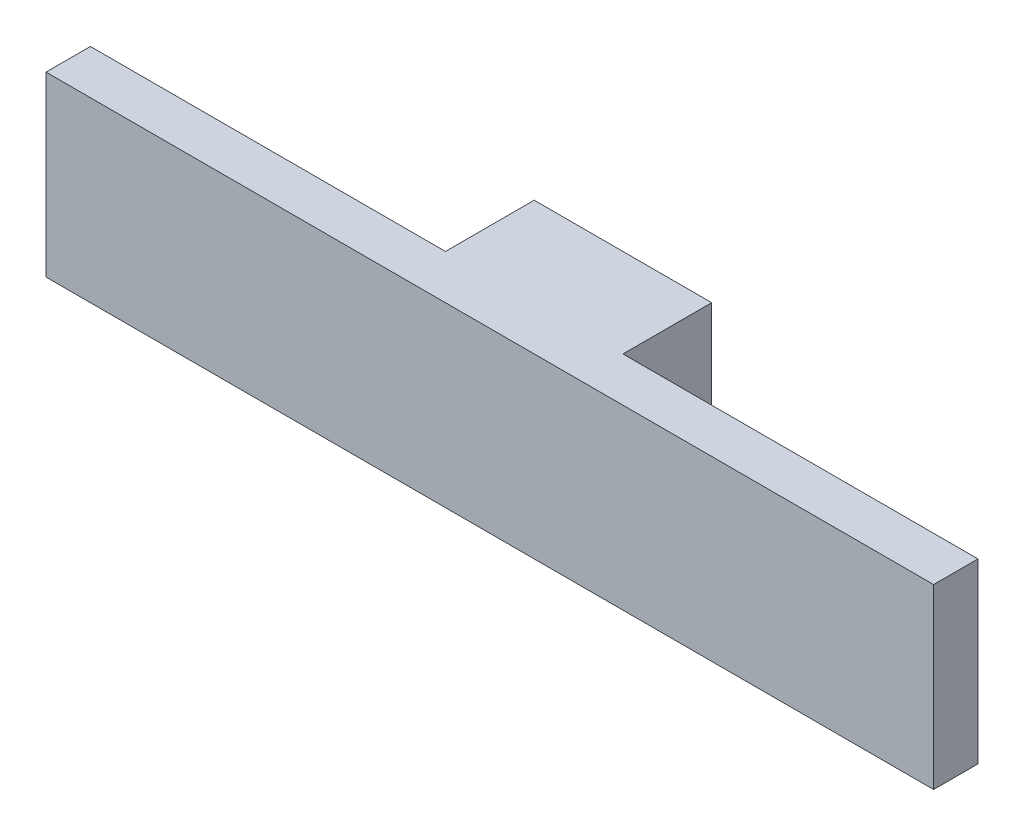
ISO-10303-21;
HEADER;
FILE_DESCRIPTION(('STEP AP214'),'2;1');
FILE_NAME('part.step','',(''),(''),'','','');
FILE_SCHEMA(('AUTOMOTIVE_DESIGN { 1 0 10303 214 1 1 1 1 }'));
ENDSEC;
DATA;
#1=APPLICATION_CONTEXT('core data for automotive mechanical design processes');
#2=APPLICATION_PROTOCOL_DEFINITION('international standard','automotive_design',2000,#1);
#3=PRODUCT_CONTEXT('',#1,'mechanical');
#4=PRODUCT('Part','Part','',(#3));
#5=PRODUCT_RELATED_PRODUCT_CATEGORY('part','',(#4));
#6=PRODUCT_DEFINITION_FORMATION('','',#4);
#7=PRODUCT_DEFINITION_CONTEXT('part definition',#1,'design');
#8=PRODUCT_DEFINITION('design','',#6,#7);
#9=PRODUCT_DEFINITION_SHAPE('','',#8);
#10=(LENGTH_UNIT() NAMED_UNIT(*) SI_UNIT(.MILLI.,.METRE.));
#11=(NAMED_UNIT(*) PLANE_ANGLE_UNIT() SI_UNIT($,.RADIAN.));
#12=(NAMED_UNIT(*) SI_UNIT($,.STERADIAN.) SOLID_ANGLE_UNIT());
#13=UNCERTAINTY_MEASURE_WITH_UNIT(LENGTH_MEASURE(1.E-05),#10,'distance_accuracy_value','');
#14=(GEOMETRIC_REPRESENTATION_CONTEXT(3) GLOBAL_UNCERTAINTY_ASSIGNED_CONTEXT((#13)) GLOBAL_UNIT_ASSIGNED_CONTEXT((#10,
#11,#12)) REPRESENTATION_CONTEXT('',''));
#15=CARTESIAN_POINT('',(0.,0.,0.));
#16=DIRECTION('',(0.,0.,1.));
#17=DIRECTION('',(1.,0.,0.));
#18=AXIS2_PLACEMENT_3D('',#15,#16,#17);
#19=CARTESIAN_POINT('',(50.,20.,15.));
#20=DIRECTION('',(-1.,0.,0.));
#21=DIRECTION('',(0.,0.,1.));
#22=AXIS2_PLACEMENT_3D('',#19,#20,#21);
#23=PLANE('',#22);
#24=DIRECTION('',(0.,0.,-1.));
#25=VECTOR('',#24,1.);
#26=CARTESIAN_POINT('',(50.,0.,15.));
#27=LINE('',#26,#25);
#28=CARTESIAN_POINT('',(50.,0.,15.));
#29=VERTEX_POINT('',#28);
#30=CARTESIAN_POINT('',(50.,0.,10.));
#31=VERTEX_POINT('',#30);
#32=EDGE_CURVE('E140',#29,#31,#27,.T.);
#33=ORIENTED_EDGE('',*,*,#32,.T.);
#34=DIRECTION('',(0.,-1.,0.));
#35=VECTOR('',#34,1.);
#36=CARTESIAN_POINT('',(50.,20.,10.));
#37=LINE('',#36,#35);
#38=CARTESIAN_POINT('',(50.,20.,10.));
#39=VERTEX_POINT('',#38);
#40=EDGE_CURVE('E11',#39,#31,#37,.T.);
#41=ORIENTED_EDGE('',*,*,#40,.F.);
#42=DIRECTION('',(0.,0.,-1.));
#43=VECTOR('',#42,1.);
#44=CARTESIAN_POINT('',(50.,20.,15.));
#45=LINE('',#44,#43);
#46=CARTESIAN_POINT('',(50.,20.,15.));
#47=VERTEX_POINT('',#46);
#48=EDGE_CURVE('E162',#47,#39,#45,.T.);
#49=ORIENTED_EDGE('',*,*,#48,.F.);
#50=DIRECTION('',(0.,-1.,0.));
#51=VECTOR('',#50,1.);
#52=CARTESIAN_POINT('',(50.,20.,15.));
#53=LINE('',#52,#51);
#54=EDGE_CURVE('E136',#47,#29,#53,.T.);
#55=ORIENTED_EDGE('',*,*,#54,.T.);
#56=EDGE_LOOP('',(#33,#41,#49,#55));
#57=FACE_BOUND('',#56,.T.);
#58=ADVANCED_FACE('F39',(#57),#23,.F.);
#59=CARTESIAN_POINT('',(50.,20.,10.));
#60=DIRECTION('',(0.,0.,1.));
#61=DIRECTION('',(1.,0.,0.));
#62=AXIS2_PLACEMENT_3D('',#59,#60,#61);
#63=PLANE('',#62);
#64=DIRECTION('',(-1.,0.,0.));
#65=VECTOR('',#64,1.);
#66=CARTESIAN_POINT('',(50.,0.,10.));
#67=LINE('',#66,#65);
#68=CARTESIAN_POINT('',(10.,0.,10.));
#69=VERTEX_POINT('',#68);
#70=EDGE_CURVE('E144',#31,#69,#67,.T.);
#71=ORIENTED_EDGE('',*,*,#70,.T.);
#72=DIRECTION('',(0.,-1.,0.));
#73=VECTOR('',#72,1.);
#74=CARTESIAN_POINT('',(10.,20.,10.));
#75=LINE('',#74,#73);
#76=CARTESIAN_POINT('',(10.,20.,10.));
#77=VERTEX_POINT('',#76);
#78=EDGE_CURVE('E48',#77,#69,#75,.T.);
#79=ORIENTED_EDGE('',*,*,#78,.F.);
#80=DIRECTION('',(-1.,0.,0.));
#81=VECTOR('',#80,1.);
#82=CARTESIAN_POINT('',(50.,20.,10.));
#83=LINE('',#82,#81);
#84=EDGE_CURVE('E99',#39,#77,#83,.T.);
#85=ORIENTED_EDGE('',*,*,#84,.F.);
#86=ORIENTED_EDGE('',*,*,#40,.T.);
#87=EDGE_LOOP('',(#71,#79,#85,#86));
#88=FACE_BOUND('',#87,.T.);
#89=ADVANCED_FACE('F208',(#88),#63,.F.);
#90=CARTESIAN_POINT('',(10.,20.,10.));
#91=DIRECTION('',(-1.,0.,0.));
#92=DIRECTION('',(0.,0.,1.));
#93=AXIS2_PLACEMENT_3D('',#90,#91,#92);
#94=PLANE('',#93);
#95=DIRECTION('',(0.,0.,-1.));
#96=VECTOR('',#95,1.);
#97=CARTESIAN_POINT('',(10.,0.,10.));
#98=LINE('',#97,#96);
#99=CARTESIAN_POINT('',(10.,0.,0.));
#100=VERTEX_POINT('',#99);
#101=EDGE_CURVE('E147',#69,#100,#98,.T.);
#102=ORIENTED_EDGE('',*,*,#101,.T.);
#103=DIRECTION('',(0.,-1.,0.));
#104=VECTOR('',#103,1.);
#105=CARTESIAN_POINT('',(10.,20.,0.));
#106=LINE('',#105,#104);
#107=CARTESIAN_POINT('',(10.,20.,0.));
#108=VERTEX_POINT('',#107);
#109=EDGE_CURVE('E173',#108,#100,#106,.T.);
#110=ORIENTED_EDGE('',*,*,#109,.F.);
#111=DIRECTION('',(0.,0.,-1.));
#112=VECTOR('',#111,1.);
#113=CARTESIAN_POINT('',(10.,20.,10.));
#114=LINE('',#113,#112);
#115=EDGE_CURVE('E183',#77,#108,#114,.T.);
#116=ORIENTED_EDGE('',*,*,#115,.F.);
#117=ORIENTED_EDGE('',*,*,#78,.T.);
#118=EDGE_LOOP('',(#102,#110,#116,#117));
#119=FACE_BOUND('',#118,.T.);
#120=ADVANCED_FACE('F181',(#119),#94,.F.);
#121=CARTESIAN_POINT('',(-10.,20.,0.));
#122=DIRECTION('',(0.,0.,1.));
#123=DIRECTION('',(1.,0.,0.));
#124=AXIS2_PLACEMENT_3D('',#121,#122,#123);
#125=PLANE('',#124);
#126=DIRECTION('',(-1.,0.,0.));
#127=VECTOR('',#126,1.);
#128=CARTESIAN_POINT('',(-10.,0.,0.));
#129=LINE('',#128,#127);
#130=CARTESIAN_POINT('',(-10.,0.,0.));
#131=VERTEX_POINT('',#130);
#132=EDGE_CURVE('E150',#100,#131,#129,.T.);
#133=ORIENTED_EDGE('',*,*,#132,.T.);
#134=DIRECTION('',(0.,-1.,0.));
#135=VECTOR('',#134,1.);
#136=CARTESIAN_POINT('',(-10.,20.,0.));
#137=LINE('',#136,#135);
#138=CARTESIAN_POINT('',(-10.,20.,0.));
#139=VERTEX_POINT('',#138);
#140=EDGE_CURVE('E169',#139,#131,#137,.T.);
#141=ORIENTED_EDGE('',*,*,#140,.F.);
#142=DIRECTION('',(-1.,0.,0.));
#143=VECTOR('',#142,1.);
#144=CARTESIAN_POINT('',(-10.,20.,0.));
#145=LINE('',#144,#143);
#146=EDGE_CURVE('E196',#108,#139,#145,.T.);
#147=ORIENTED_EDGE('',*,*,#146,.F.);
#148=ORIENTED_EDGE('',*,*,#109,.T.);
#149=EDGE_LOOP('',(#133,#141,#147,#148));
#150=FACE_BOUND('',#149,.T.);
#151=ADVANCED_FACE('F191',(#150),#125,.F.);
#152=CARTESIAN_POINT('',(-10.,20.,10.));
#153=DIRECTION('',(1.,0.,0.));
#154=DIRECTION('',(0.,0.,-1.));
#155=AXIS2_PLACEMENT_3D('',#152,#153,#154);
#156=PLANE('',#155);
#157=DIRECTION('',(0.,0.,1.));
#158=VECTOR('',#157,1.);
#159=CARTESIAN_POINT('',(-10.,0.,10.));
#160=LINE('',#159,#158);
#161=CARTESIAN_POINT('',(-10.,0.,10.));
#162=VERTEX_POINT('',#161);
#163=EDGE_CURVE('E153',#131,#162,#160,.T.);
#164=ORIENTED_EDGE('',*,*,#163,.T.);
#165=DIRECTION('',(0.,-1.,0.));
#166=VECTOR('',#165,1.);
#167=CARTESIAN_POINT('',(-10.,20.,10.));
#168=LINE('',#167,#166);
#169=CARTESIAN_POINT('',(-10.,20.,10.));
#170=VERTEX_POINT('',#169);
#171=EDGE_CURVE('E129',#170,#162,#168,.T.);
#172=ORIENTED_EDGE('',*,*,#171,.F.);
#173=DIRECTION('',(0.,0.,1.));
#174=VECTOR('',#173,1.);
#175=CARTESIAN_POINT('',(-10.,20.,10.));
#176=LINE('',#175,#174);
#177=EDGE_CURVE('E118',#139,#170,#176,.T.);
#178=ORIENTED_EDGE('',*,*,#177,.F.);
#179=ORIENTED_EDGE('',*,*,#140,.T.);
#180=EDGE_LOOP('',(#164,#172,#178,#179));
#181=FACE_BOUND('',#180,.T.);
#182=ADVANCED_FACE('F194',(#181),#156,.F.);
#183=CARTESIAN_POINT('',(-50.,20.,10.));
#184=DIRECTION('',(0.,0.,1.));
#185=DIRECTION('',(1.,0.,0.));
#186=AXIS2_PLACEMENT_3D('',#183,#184,#185);
#187=PLANE('',#186);
#188=DIRECTION('',(-1.,0.,0.));
#189=VECTOR('',#188,1.);
#190=CARTESIAN_POINT('',(-50.,0.,10.));
#191=LINE('',#190,#189);
#192=CARTESIAN_POINT('',(-50.,0.,10.));
#193=VERTEX_POINT('',#192);
#194=EDGE_CURVE('E127',#162,#193,#191,.T.);
#195=ORIENTED_EDGE('',*,*,#194,.T.);
#196=DIRECTION('',(0.,-1.,0.));
#197=VECTOR('',#196,1.);
#198=CARTESIAN_POINT('',(-50.,20.,10.));
#199=LINE('',#198,#197);
#200=CARTESIAN_POINT('',(-50.,20.,10.));
#201=VERTEX_POINT('',#200);
#202=EDGE_CURVE('E124',#201,#193,#199,.T.);
#203=ORIENTED_EDGE('',*,*,#202,.F.);
#204=DIRECTION('',(-1.,0.,0.));
#205=VECTOR('',#204,1.);
#206=CARTESIAN_POINT('',(-50.,20.,10.));
#207=LINE('',#206,#205);
#208=EDGE_CURVE('E112',#170,#201,#207,.T.);
#209=ORIENTED_EDGE('',*,*,#208,.F.);
#210=ORIENTED_EDGE('',*,*,#171,.T.);
#211=EDGE_LOOP('',(#195,#203,#209,#210));
#212=FACE_BOUND('',#211,.T.);
#213=ADVANCED_FACE('F125',(#212),#187,.F.);
#214=CARTESIAN_POINT('',(-50.,20.,15.));
#215=DIRECTION('',(1.,0.,0.));
#216=DIRECTION('',(0.,0.,-1.));
#217=AXIS2_PLACEMENT_3D('',#214,#215,#216);
#218=PLANE('',#217);
#219=DIRECTION('',(0.,0.,1.));
#220=VECTOR('',#219,1.);
#221=CARTESIAN_POINT('',(-50.,0.,15.));
#222=LINE('',#221,#220);
#223=CARTESIAN_POINT('',(-50.,0.,15.));
#224=VERTEX_POINT('',#223);
#225=EDGE_CURVE('E85',#193,#224,#222,.T.);
#226=ORIENTED_EDGE('',*,*,#225,.T.);
#227=DIRECTION('',(0.,-1.,0.));
#228=VECTOR('',#227,1.);
#229=CARTESIAN_POINT('',(-50.,20.,15.));
#230=LINE('',#229,#228);
#231=CARTESIAN_POINT('',(-50.,20.,15.));
#232=VERTEX_POINT('',#231);
#233=EDGE_CURVE('E130',#232,#224,#230,.T.);
#234=ORIENTED_EDGE('',*,*,#233,.F.);
#235=DIRECTION('',(0.,0.,1.));
#236=VECTOR('',#235,1.);
#237=CARTESIAN_POINT('',(-50.,20.,15.));
#238=LINE('',#237,#236);
#239=EDGE_CURVE('E116',#201,#232,#238,.T.);
#240=ORIENTED_EDGE('',*,*,#239,.F.);
#241=ORIENTED_EDGE('',*,*,#202,.T.);
#242=EDGE_LOOP('',(#226,#234,#240,#241));
#243=FACE_BOUND('',#242,.T.);
#244=ADVANCED_FACE('F132',(#243),#218,.F.);
#245=CARTESIAN_POINT('',(50.,20.,15.));
#246=DIRECTION('',(0.,0.,-1.));
#247=DIRECTION('',(-1.,0.,0.));
#248=AXIS2_PLACEMENT_3D('',#245,#246,#247);
#249=PLANE('',#248);
#250=DIRECTION('',(1.,0.,0.));
#251=VECTOR('',#250,1.);
#252=CARTESIAN_POINT('',(50.,0.,15.));
#253=LINE('',#252,#251);
#254=EDGE_CURVE('E91',#224,#29,#253,.T.);
#255=ORIENTED_EDGE('',*,*,#254,.T.);
#256=ORIENTED_EDGE('',*,*,#54,.F.);
#257=DIRECTION('',(1.,0.,0.));
#258=VECTOR('',#257,1.);
#259=CARTESIAN_POINT('',(50.,20.,15.));
#260=LINE('',#259,#258);
#261=EDGE_CURVE('E56',#232,#47,#260,.T.);
#262=ORIENTED_EDGE('',*,*,#261,.F.);
#263=ORIENTED_EDGE('',*,*,#233,.T.);
#264=EDGE_LOOP('',(#255,#256,#262,#263));
#265=FACE_BOUND('',#264,.T.);
#266=ADVANCED_FACE('F224',(#265),#249,.F.);
#267=CARTESIAN_POINT('',(0.,20.,0.));
#268=DIRECTION('',(0.,1.,0.));
#269=DIRECTION('',(0.,0.,1.));
#270=AXIS2_PLACEMENT_3D('',#267,#268,#269);
#271=PLANE('',#270);
#272=ORIENTED_EDGE('',*,*,#48,.T.);
#273=ORIENTED_EDGE('',*,*,#84,.T.);
#274=ORIENTED_EDGE('',*,*,#115,.T.);
#275=ORIENTED_EDGE('',*,*,#146,.T.);
#276=ORIENTED_EDGE('',*,*,#177,.T.);
#277=ORIENTED_EDGE('',*,*,#208,.T.);
#278=ORIENTED_EDGE('',*,*,#239,.T.);
#279=ORIENTED_EDGE('',*,*,#261,.T.);
#280=EDGE_LOOP('',(#272,#273,#274,#275,#276,#277,#278,#279));
#281=FACE_BOUND('',#280,.T.);
#282=ADVANCED_FACE('F114',(#281),#271,.T.);
#283=CARTESIAN_POINT('',(0.,0.,0.));
#284=DIRECTION('',(0.,1.,0.));
#285=DIRECTION('',(0.,0.,1.));
#286=AXIS2_PLACEMENT_3D('',#283,#284,#285);
#287=PLANE('',#286);
#288=ORIENTED_EDGE('',*,*,#32,.F.);
#289=ORIENTED_EDGE('',*,*,#254,.F.);
#290=ORIENTED_EDGE('',*,*,#225,.F.);
#291=ORIENTED_EDGE('',*,*,#194,.F.);
#292=ORIENTED_EDGE('',*,*,#163,.F.);
#293=ORIENTED_EDGE('',*,*,#132,.F.);
#294=ORIENTED_EDGE('',*,*,#101,.F.);
#295=ORIENTED_EDGE('',*,*,#70,.F.);
#296=EDGE_LOOP('',(#288,#289,#290,#291,#292,#293,#294,#295));
#297=FACE_BOUND('',#296,.T.);
#298=ADVANCED_FACE('F187',(#297),#287,.F.);
#299=CLOSED_SHELL('',(#58,#89,#120,#151,#182,#213,#244,#266,#282,#298));
#300=MANIFOLD_SOLID_BREP('B2',#299);
#301=ADVANCED_BREP_SHAPE_REPRESENTATION('',(#18,#300),#14);
#302=SHAPE_DEFINITION_REPRESENTATION(#9,#301);
ENDSEC;
END-ISO-10303-21;
